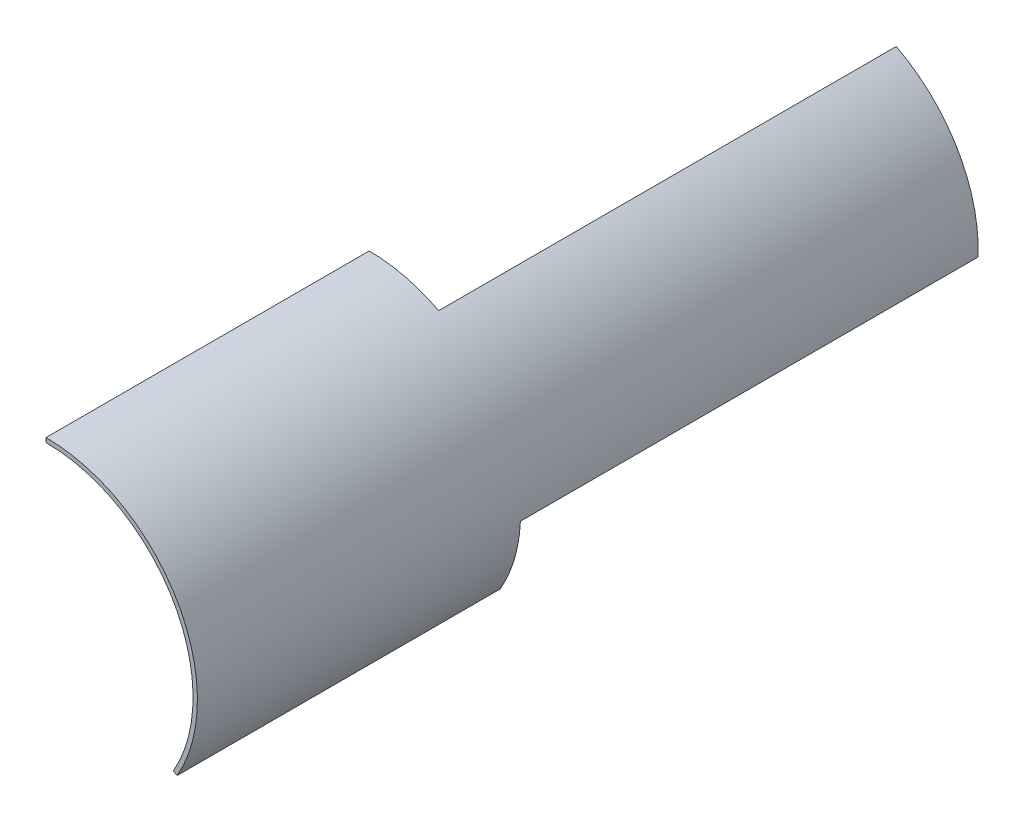
ISO-10303-21;
HEADER;
FILE_DESCRIPTION(('STEP AP214'),'2;1');
FILE_NAME('part.step','',(''),(''),'','','');
FILE_SCHEMA(('AUTOMOTIVE_DESIGN { 1 0 10303 214 1 1 1 1 }'));
ENDSEC;
DATA;
#1=APPLICATION_CONTEXT('core data for automotive mechanical design processes');
#2=APPLICATION_PROTOCOL_DEFINITION('international standard','automotive_design',2000,#1);
#3=PRODUCT_CONTEXT('',#1,'mechanical');
#4=PRODUCT('Part','Part','',(#3));
#5=PRODUCT_RELATED_PRODUCT_CATEGORY('part','',(#4));
#6=PRODUCT_DEFINITION_FORMATION('','',#4);
#7=PRODUCT_DEFINITION_CONTEXT('part definition',#1,'design');
#8=PRODUCT_DEFINITION('design','',#6,#7);
#9=PRODUCT_DEFINITION_SHAPE('','',#8);
#10=(LENGTH_UNIT() NAMED_UNIT(*) SI_UNIT(.MILLI.,.METRE.));
#11=(NAMED_UNIT(*) PLANE_ANGLE_UNIT() SI_UNIT($,.RADIAN.));
#12=(NAMED_UNIT(*) SI_UNIT($,.STERADIAN.) SOLID_ANGLE_UNIT());
#13=UNCERTAINTY_MEASURE_WITH_UNIT(LENGTH_MEASURE(1.E-05),#10,'distance_accuracy_value','');
#14=(GEOMETRIC_REPRESENTATION_CONTEXT(3) GLOBAL_UNCERTAINTY_ASSIGNED_CONTEXT((#13)) GLOBAL_UNIT_ASSIGNED_CONTEXT((#10,
#11,#12)) REPRESENTATION_CONTEXT('',''));
#15=CARTESIAN_POINT('',(0.,0.,0.));
#16=DIRECTION('',(0.,0.,1.));
#17=DIRECTION('',(1.,0.,0.));
#18=AXIS2_PLACEMENT_3D('',#15,#16,#17);
#19=CARTESIAN_POINT('',(35.0740288532697,-20.2500000000002,-89.));
#20=DIRECTION('',(0.,0.,1.));
#21=DIRECTION('',(1.,0.,0.));
#22=AXIS2_PLACEMENT_3D('',#19,#20,#21);
#23=PLANE('',#22);
#24=CARTESIAN_POINT('',(0.,0.,-89.));
#25=DIRECTION('',(0.,0.,1.));
#26=DIRECTION('',(1.,0.,0.));
#27=AXIS2_PLACEMENT_3D('',#24,#25,#26);
#28=CIRCLE('',#27,40.5);
#29=CARTESIAN_POINT('',(35.0740288532697,-20.2500000000002,-89.));
#30=VERTEX_POINT('',#29);
#31=CARTESIAN_POINT('',(40.4678046093114,-1.61455569820073,-89.));
#32=VERTEX_POINT('',#31);
#33=EDGE_CURVE('E59',#30,#32,#28,.T.);
#34=ORIENTED_EDGE('',*,*,#33,.T.);
#35=DIRECTION('',(0.965925826289068,-0.258819045102523,0.));
#36=VECTOR('',#35,1.);
#37=CARTESIAN_POINT('',(41.6551871560902,-1.93271389271692,-89.));
#38=LINE('',#37,#36);
#39=CARTESIAN_POINT('',(41.6551871560902,-1.93271389271692,-89.));
#40=VERTEX_POINT('',#39);
#41=EDGE_CURVE('E175',#32,#40,#38,.T.);
#42=ORIENTED_EDGE('',*,*,#41,.T.);
#43=CARTESIAN_POINT('',(0.,0.,-89.));
#44=DIRECTION('',(0.,0.,1.));
#45=DIRECTION('',(1.,0.,0.));
#46=AXIS2_PLACEMENT_3D('',#43,#44,#45);
#47=CIRCLE('',#46,41.7);
#48=CARTESIAN_POINT('',(36.113259337811,-20.8500000000002,-89.));
#49=VERTEX_POINT('',#48);
#50=EDGE_CURVE('E51',#49,#40,#47,.T.);
#51=ORIENTED_EDGE('',*,*,#50,.F.);
#52=DIRECTION('',(0.866025403784436,-0.500000000000004,0.));
#53=VECTOR('',#52,1.);
#54=CARTESIAN_POINT('',(35.0740288532697,-20.2500000000002,-89.));
#55=LINE('',#54,#53);
#56=EDGE_CURVE('E152',#30,#49,#55,.T.);
#57=ORIENTED_EDGE('',*,*,#56,.F.);
#58=EDGE_LOOP('',(#34,#42,#51,#57));
#59=FACE_BOUND('',#58,.T.);
#60=ADVANCED_FACE('F33',(#59),#23,.F.);
#61=CARTESIAN_POINT('',(0.,0.,0.));
#62=DIRECTION('',(0.,0.,1.));
#63=DIRECTION('',(1.,0.,0.));
#64=AXIS2_PLACEMENT_3D('',#61,#62,#63);
#65=CYLINDRICAL_SURFACE('',#64,41.7);
#66=DIRECTION('',(0.,0.,1.));
#67=VECTOR('',#66,1.);
#68=CARTESIAN_POINT('',(19.1488573996686,37.04336999096,0.));
#69=LINE('',#68,#67);
#70=CARTESIAN_POINT('',(19.1488573996686,37.04336999096,-215.));
#71=VERTEX_POINT('',#70);
#72=CARTESIAN_POINT('',(19.1488573996686,37.04336999096,-89.));
#73=VERTEX_POINT('',#72);
#74=EDGE_CURVE('E108',#71,#73,#69,.T.);
#75=ORIENTED_EDGE('',*,*,#74,.T.);
#76=CARTESIAN_POINT('',(0.,41.7,-89.));
#77=VERTEX_POINT('',#76);
#78=EDGE_CURVE('E37',#73,#77,#47,.T.);
#79=ORIENTED_EDGE('',*,*,#78,.T.);
#80=DIRECTION('',(0.,0.,1.));
#81=VECTOR('',#80,1.);
#82=CARTESIAN_POINT('',(0.,41.7,-89.));
#83=LINE('',#82,#81);
#84=CARTESIAN_POINT('',(0.,41.7,0.));
#85=VERTEX_POINT('',#84);
#86=EDGE_CURVE('E128',#77,#85,#83,.T.);
#87=ORIENTED_EDGE('',*,*,#86,.T.);
#88=CARTESIAN_POINT('',(0.,0.,0.));
#89=DIRECTION('',(0.,0.,1.));
#90=DIRECTION('',(1.,0.,0.));
#91=AXIS2_PLACEMENT_3D('',#88,#89,#90);
#92=CIRCLE('',#91,41.7);
#93=CARTESIAN_POINT('',(36.113259337811,-20.8500000000002,0.));
#94=VERTEX_POINT('',#93);
#95=EDGE_CURVE('E11',#94,#85,#92,.T.);
#96=ORIENTED_EDGE('',*,*,#95,.F.);
#97=DIRECTION('',(0.,0.,1.));
#98=VECTOR('',#97,1.);
#99=CARTESIAN_POINT('',(36.113259337811,-20.8500000000002,-89.));
#100=LINE('',#99,#98);
#101=EDGE_CURVE('E144',#49,#94,#100,.T.);
#102=ORIENTED_EDGE('',*,*,#101,.F.);
#103=ORIENTED_EDGE('',*,*,#50,.T.);
#104=DIRECTION('',(0.,0.,-1.));
#105=VECTOR('',#104,1.);
#106=CARTESIAN_POINT('',(41.6551871560902,-1.93271389271692,-85.3006856942631));
#107=LINE('',#106,#105);
#108=CARTESIAN_POINT('',(41.6551871560902,-1.93271389271692,-215.));
#109=VERTEX_POINT('',#108);
#110=EDGE_CURVE('E130',#40,#109,#107,.T.);
#111=ORIENTED_EDGE('',*,*,#110,.T.);
#112=CARTESIAN_POINT('',(0.,0.,-215.));
#113=DIRECTION('',(0.,0.,-1.));
#114=DIRECTION('',(-1.,0.,0.));
#115=AXIS2_PLACEMENT_3D('',#112,#113,#114);
#116=CIRCLE('',#115,41.7);
#117=EDGE_CURVE('E125',#71,#109,#116,.T.);
#118=ORIENTED_EDGE('',*,*,#117,.F.);
#119=EDGE_LOOP('',(#75,#79,#87,#96,#102,#103,#111,#118));
#120=FACE_BOUND('',#119,.T.);
#121=ADVANCED_FACE('F179',(#120),#65,.T.);
#122=CARTESIAN_POINT('',(36.113259337811,-20.8500000000002,0.));
#123=DIRECTION('',(0.,0.,-1.));
#124=DIRECTION('',(-1.,0.,0.));
#125=AXIS2_PLACEMENT_3D('',#122,#123,#124);
#126=PLANE('',#125);
#127=CARTESIAN_POINT('',(0.,0.,0.));
#128=DIRECTION('',(0.,0.,1.));
#129=DIRECTION('',(1.,0.,0.));
#130=AXIS2_PLACEMENT_3D('',#127,#128,#129);
#131=CIRCLE('',#130,40.5);
#132=CARTESIAN_POINT('',(35.0740288532697,-20.2500000000002,0.));
#133=VERTEX_POINT('',#132);
#134=CARTESIAN_POINT('',(0.,40.5,0.));
#135=VERTEX_POINT('',#134);
#136=EDGE_CURVE('E43',#133,#135,#131,.T.);
#137=ORIENTED_EDGE('',*,*,#136,.F.);
#138=DIRECTION('',(-0.866025403784436,0.500000000000004,0.));
#139=VECTOR('',#138,1.);
#140=CARTESIAN_POINT('',(36.113259337811,-20.8500000000002,0.));
#141=LINE('',#140,#139);
#142=EDGE_CURVE('E147',#94,#133,#141,.T.);
#143=ORIENTED_EDGE('',*,*,#142,.F.);
#144=ORIENTED_EDGE('',*,*,#95,.T.);
#145=DIRECTION('',(0.,-1.,0.));
#146=VECTOR('',#145,1.);
#147=CARTESIAN_POINT('',(0.,41.7,0.));
#148=LINE('',#147,#146);
#149=EDGE_CURVE('E136',#85,#135,#148,.T.);
#150=ORIENTED_EDGE('',*,*,#149,.T.);
#151=EDGE_LOOP('',(#137,#143,#144,#150));
#152=FACE_BOUND('',#151,.T.);
#153=ADVANCED_FACE('F35',(#152),#126,.F.);
#154=CARTESIAN_POINT('',(0.,0.,0.));
#155=DIRECTION('',(0.,0.,1.));
#156=DIRECTION('',(1.,0.,0.));
#157=AXIS2_PLACEMENT_3D('',#154,#155,#156);
#158=CYLINDRICAL_SURFACE('',#157,40.5);
#159=CARTESIAN_POINT('',(18.8307088085024,35.8560232843715,-89.));
#160=VERTEX_POINT('',#159);
#161=CARTESIAN_POINT('',(0.,40.5,-89.));
#162=VERTEX_POINT('',#161);
#163=EDGE_CURVE('E118',#160,#162,#28,.T.);
#164=ORIENTED_EDGE('',*,*,#163,.F.);
#165=DIRECTION('',(0.,0.,-1.));
#166=VECTOR('',#165,1.);
#167=CARTESIAN_POINT('',(18.8307088085024,35.8560232843715,-81.9562544659037));
#168=LINE('',#167,#166);
#169=CARTESIAN_POINT('',(18.8307088085024,35.8560232843715,-215.));
#170=VERTEX_POINT('',#169);
#171=EDGE_CURVE('E106',#160,#170,#168,.T.);
#172=ORIENTED_EDGE('',*,*,#171,.T.);
#173=CARTESIAN_POINT('',(0.,0.,-215.));
#174=DIRECTION('',(0.,0.,-1.));
#175=DIRECTION('',(-1.,0.,0.));
#176=AXIS2_PLACEMENT_3D('',#173,#174,#175);
#177=CIRCLE('',#176,40.5);
#178=CARTESIAN_POINT('',(40.4678046093114,-1.61455569820074,-215.));
#179=VERTEX_POINT('',#178);
#180=EDGE_CURVE('E115',#170,#179,#177,.T.);
#181=ORIENTED_EDGE('',*,*,#180,.T.);
#182=DIRECTION('',(0.,0.,1.));
#183=VECTOR('',#182,1.);
#184=CARTESIAN_POINT('',(40.4678046093114,-1.61455569820073,0.));
#185=LINE('',#184,#183);
#186=EDGE_CURVE('E126',#179,#32,#185,.T.);
#187=ORIENTED_EDGE('',*,*,#186,.T.);
#188=ORIENTED_EDGE('',*,*,#33,.F.);
#189=DIRECTION('',(0.,0.,-1.));
#190=VECTOR('',#189,1.);
#191=CARTESIAN_POINT('',(35.0740288532697,-20.2500000000002,0.));
#192=LINE('',#191,#190);
#193=EDGE_CURVE('E150',#133,#30,#192,.T.);
#194=ORIENTED_EDGE('',*,*,#193,.F.);
#195=ORIENTED_EDGE('',*,*,#136,.T.);
#196=DIRECTION('',(0.,0.,-1.));
#197=VECTOR('',#196,1.);
#198=CARTESIAN_POINT('',(0.,40.5,0.));
#199=LINE('',#198,#197);
#200=EDGE_CURVE('E139',#135,#162,#199,.T.);
#201=ORIENTED_EDGE('',*,*,#200,.T.);
#202=EDGE_LOOP('',(#164,#172,#181,#187,#188,#194,#195,#201));
#203=FACE_BOUND('',#202,.T.);
#204=ADVANCED_FACE('F114',(#203),#158,.F.);
#205=DIRECTION('',(0.,1.,0.));
#206=VECTOR('',#205,1.);
#207=CARTESIAN_POINT('',(0.,40.5,-89.));
#208=LINE('',#207,#206);
#209=EDGE_CURVE('E141',#162,#77,#208,.T.);
#210=ORIENTED_EDGE('',*,*,#209,.T.);
#211=ORIENTED_EDGE('',*,*,#78,.F.);
#212=DIRECTION('',(-0.258819045102527,-0.965925826289067,0.));
#213=VECTOR('',#212,1.);
#214=CARTESIAN_POINT('',(18.8307088085024,35.8560232843715,-89.));
#215=LINE('',#214,#213);
#216=EDGE_CURVE('E112',#73,#160,#215,.T.);
#217=ORIENTED_EDGE('',*,*,#216,.T.);
#218=ORIENTED_EDGE('',*,*,#163,.T.);
#219=EDGE_LOOP('',(#210,#211,#217,#218));
#220=FACE_BOUND('',#219,.T.);
#221=ADVANCED_FACE('F170',(#220),#23,.F.);
#222=CARTESIAN_POINT('',(0.,0.,0.));
#223=DIRECTION('',(-0.500000000000004,-0.866025403784436,0.));
#224=DIRECTION('',(0.,0.,-1.));
#225=AXIS2_PLACEMENT_3D('',#222,#223,#224);
#226=PLANE('',#225);
#227=ORIENTED_EDGE('',*,*,#101,.T.);
#228=ORIENTED_EDGE('',*,*,#142,.T.);
#229=ORIENTED_EDGE('',*,*,#193,.T.);
#230=ORIENTED_EDGE('',*,*,#56,.T.);
#231=EDGE_LOOP('',(#227,#228,#229,#230));
#232=FACE_BOUND('',#231,.T.);
#233=ADVANCED_FACE('F184',(#232),#226,.T.);
#234=CARTESIAN_POINT('',(0.,0.,0.));
#235=DIRECTION('',(1.,0.,0.));
#236=DIRECTION('',(0.,0.,-1.));
#237=AXIS2_PLACEMENT_3D('',#234,#235,#236);
#238=PLANE('',#237);
#239=ORIENTED_EDGE('',*,*,#86,.F.);
#240=ORIENTED_EDGE('',*,*,#209,.F.);
#241=ORIENTED_EDGE('',*,*,#200,.F.);
#242=ORIENTED_EDGE('',*,*,#149,.F.);
#243=EDGE_LOOP('',(#239,#240,#241,#242));
#244=FACE_BOUND('',#243,.T.);
#245=ADVANCED_FACE('F168',(#244),#238,.F.);
#246=CARTESIAN_POINT('',(18.3866152394517,36.0857642296289,-215.));
#247=DIRECTION('',(0.,0.,-1.));
#248=DIRECTION('',(-1.,0.,0.));
#249=AXIS2_PLACEMENT_3D('',#246,#247,#248);
#250=PLANE('',#249);
#251=DIRECTION('',(-0.258819045102527,-0.965925826289067,0.));
#252=VECTOR('',#251,1.);
#253=CARTESIAN_POINT('',(18.8307088085024,35.8560232843715,-215.));
#254=LINE('',#253,#252);
#255=EDGE_CURVE('E102',#71,#170,#254,.T.);
#256=ORIENTED_EDGE('',*,*,#255,.F.);
#257=ORIENTED_EDGE('',*,*,#117,.T.);
#258=DIRECTION('',(0.965925826289068,-0.258819045102523,0.));
#259=VECTOR('',#258,1.);
#260=CARTESIAN_POINT('',(41.6551871560902,-1.93271389271692,-215.));
#261=LINE('',#260,#259);
#262=EDGE_CURVE('E124',#179,#109,#261,.T.);
#263=ORIENTED_EDGE('',*,*,#262,.F.);
#264=ORIENTED_EDGE('',*,*,#180,.F.);
#265=EDGE_LOOP('',(#256,#257,#263,#264));
#266=FACE_BOUND('',#265,.T.);
#267=ADVANCED_FACE('F122',(#266),#250,.T.);
#268=CARTESIAN_POINT('',(41.6551871560902,-1.93271389271692,-85.3006856942631));
#269=DIRECTION('',(0.258819045102523,0.965925826289068,0.));
#270=DIRECTION('',(-0.965925826289068,0.258819045102523,0.));
#271=AXIS2_PLACEMENT_3D('',#268,#269,#270);
#272=PLANE('',#271);
#273=ORIENTED_EDGE('',*,*,#262,.T.);
#274=ORIENTED_EDGE('',*,*,#110,.F.);
#275=ORIENTED_EDGE('',*,*,#41,.F.);
#276=ORIENTED_EDGE('',*,*,#186,.F.);
#277=EDGE_LOOP('',(#273,#274,#275,#276));
#278=FACE_BOUND('',#277,.T.);
#279=ADVANCED_FACE('F182',(#278),#272,.F.);
#280=CARTESIAN_POINT('',(18.8307088085024,35.8560232843715,-81.9562544659037));
#281=DIRECTION('',(0.965925826289067,-0.258819045102527,0.));
#282=DIRECTION('',(0.258819045102527,0.965925826289067,0.));
#283=AXIS2_PLACEMENT_3D('',#280,#281,#282);
#284=PLANE('',#283);
#285=ORIENTED_EDGE('',*,*,#255,.T.);
#286=ORIENTED_EDGE('',*,*,#171,.F.);
#287=ORIENTED_EDGE('',*,*,#216,.F.);
#288=ORIENTED_EDGE('',*,*,#74,.F.);
#289=EDGE_LOOP('',(#285,#286,#287,#288));
#290=FACE_BOUND('',#289,.T.);
#291=ADVANCED_FACE('F104',(#290),#284,.F.);
#292=CLOSED_SHELL('',(#60,#121,#153,#204,#221,#233,#245,#267,#279,#291));
#293=MANIFOLD_SOLID_BREP('B2',#292);
#294=ADVANCED_BREP_SHAPE_REPRESENTATION('',(#18,#293),#14);
#295=SHAPE_DEFINITION_REPRESENTATION(#9,#294);
ENDSEC;
END-ISO-10303-21;
